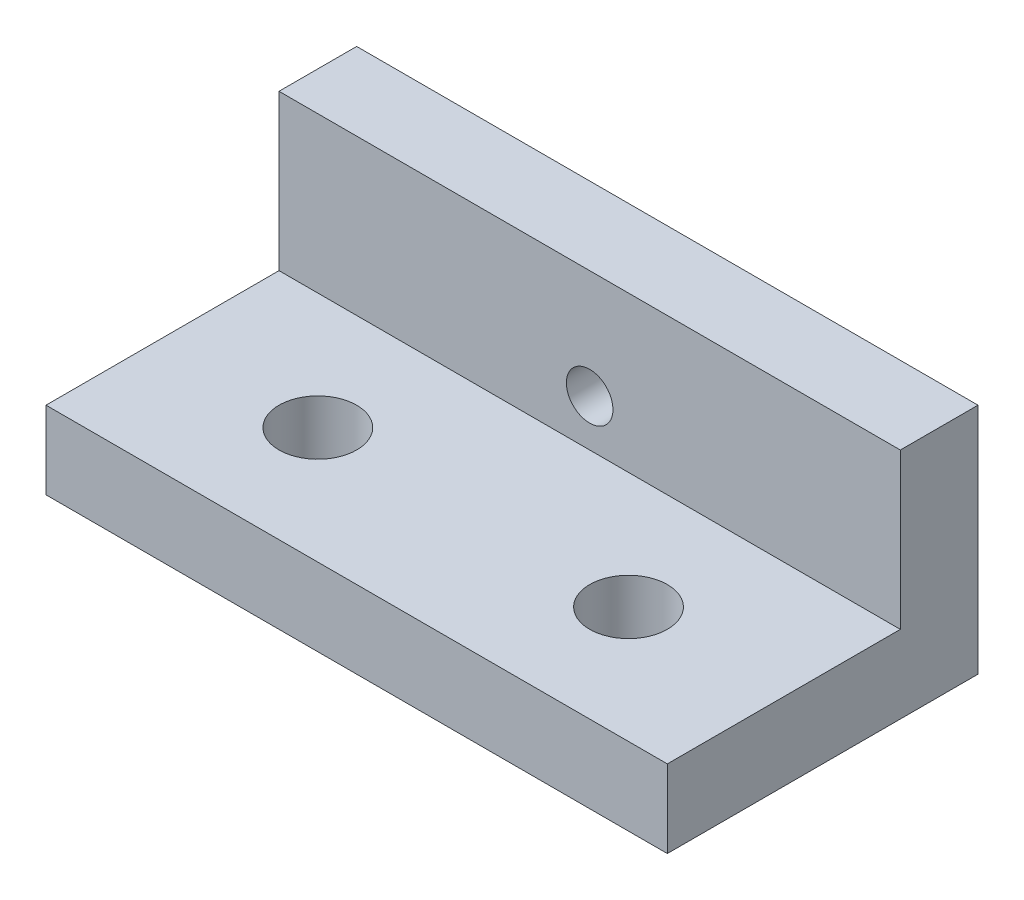
ISO-10303-21;
HEADER;
FILE_DESCRIPTION(('STEP AP214'),'2;1');
FILE_NAME('part.step','',(''),(''),'','','');
FILE_SCHEMA(('AUTOMOTIVE_DESIGN { 1 0 10303 214 1 1 1 1 }'));
ENDSEC;
DATA;
#1=APPLICATION_CONTEXT('core data for automotive mechanical design processes');
#2=APPLICATION_PROTOCOL_DEFINITION('international standard','automotive_design',2000,#1);
#3=PRODUCT_CONTEXT('',#1,'mechanical');
#4=PRODUCT('Part','Part','',(#3));
#5=PRODUCT_RELATED_PRODUCT_CATEGORY('part','',(#4));
#6=PRODUCT_DEFINITION_FORMATION('','',#4);
#7=PRODUCT_DEFINITION_CONTEXT('part definition',#1,'design');
#8=PRODUCT_DEFINITION('design','',#6,#7);
#9=PRODUCT_DEFINITION_SHAPE('','',#8);
#10=(LENGTH_UNIT() NAMED_UNIT(*) SI_UNIT(.MILLI.,.METRE.));
#11=(NAMED_UNIT(*) PLANE_ANGLE_UNIT() SI_UNIT($,.RADIAN.));
#12=(NAMED_UNIT(*) SI_UNIT($,.STERADIAN.) SOLID_ANGLE_UNIT());
#13=UNCERTAINTY_MEASURE_WITH_UNIT(LENGTH_MEASURE(1.E-05),#10,'distance_accuracy_value','');
#14=(GEOMETRIC_REPRESENTATION_CONTEXT(3) GLOBAL_UNCERTAINTY_ASSIGNED_CONTEXT((#13)) GLOBAL_UNIT_ASSIGNED_CONTEXT((#10,
#11,#12)) REPRESENTATION_CONTEXT('',''));
#15=CARTESIAN_POINT('',(0.,0.,0.));
#16=DIRECTION('',(0.,0.,1.));
#17=DIRECTION('',(1.,0.,0.));
#18=AXIS2_PLACEMENT_3D('',#15,#16,#17);
#19=CARTESIAN_POINT('',(0.,3.175,0.));
#20=DIRECTION('',(0.,-1.,0.));
#21=DIRECTION('',(0.,0.,-1.));
#22=AXIS2_PLACEMENT_3D('',#19,#20,#21);
#23=PLANE('',#22);
#24=CARTESIAN_POINT('',(19.05,3.175,-4.7625));
#25=DIRECTION('',(0.,1.,0.));
#26=DIRECTION('',(0.,0.,-1.));
#27=AXIS2_PLACEMENT_3D('',#24,#25,#26);
#28=CIRCLE('',#27,1.5875);
#29=CARTESIAN_POINT('',(19.05,3.175,-6.35));
#30=VERTEX_POINT('',#29);
#31=EDGE_CURVE('E159',#30,#30,#28,.T.);
#32=ORIENTED_EDGE('',*,*,#31,.F.);
#33=EDGE_LOOP('',(#32));
#34=FACE_BOUND('',#33,.T.);
#35=CARTESIAN_POINT('',(6.35,3.175,-4.7625));
#36=DIRECTION('',(0.,1.,0.));
#37=DIRECTION('',(0.,0.,1.));
#38=AXIS2_PLACEMENT_3D('',#35,#36,#37);
#39=CIRCLE('',#38,1.5875);
#40=CARTESIAN_POINT('',(6.35,3.175,-3.175));
#41=VERTEX_POINT('',#40);
#42=EDGE_CURVE('E153',#41,#41,#39,.T.);
#43=ORIENTED_EDGE('',*,*,#42,.F.);
#44=EDGE_LOOP('',(#43));
#45=FACE_BOUND('',#44,.T.);
#46=DIRECTION('',(1.,0.,0.));
#47=VECTOR('',#46,1.);
#48=CARTESIAN_POINT('',(0.,3.175,-9.525));
#49=LINE('',#48,#47);
#50=CARTESIAN_POINT('',(0.,3.175,-9.525));
#51=VERTEX_POINT('',#50);
#52=CARTESIAN_POINT('',(25.4,3.175,-9.525));
#53=VERTEX_POINT('',#52);
#54=EDGE_CURVE('E50',#51,#53,#49,.T.);
#55=ORIENTED_EDGE('',*,*,#54,.F.);
#56=DIRECTION('',(0.,0.,1.));
#57=VECTOR('',#56,1.);
#58=CARTESIAN_POINT('',(0.,3.175,0.));
#59=LINE('',#58,#57);
#60=CARTESIAN_POINT('',(0.,3.175,0.));
#61=VERTEX_POINT('',#60);
#62=EDGE_CURVE('E87',#51,#61,#59,.T.);
#63=ORIENTED_EDGE('',*,*,#62,.T.);
#64=DIRECTION('',(1.,0.,0.));
#65=VECTOR('',#64,1.);
#66=CARTESIAN_POINT('',(0.,3.175,0.));
#67=LINE('',#66,#65);
#68=CARTESIAN_POINT('',(25.4,3.175,0.));
#69=VERTEX_POINT('',#68);
#70=EDGE_CURVE('E56',#61,#69,#67,.T.);
#71=ORIENTED_EDGE('',*,*,#70,.T.);
#72=DIRECTION('',(0.,0.,-1.));
#73=VECTOR('',#72,1.);
#74=CARTESIAN_POINT('',(25.4,3.175,0.));
#75=LINE('',#74,#73);
#76=EDGE_CURVE('E98',#69,#53,#75,.T.);
#77=ORIENTED_EDGE('',*,*,#76,.T.);
#78=EDGE_LOOP('',(#55,#63,#71,#77));
#79=FACE_BOUND('',#78,.T.);
#80=ADVANCED_FACE('F33',(#34,#45,#79),#23,.F.);
#81=CARTESIAN_POINT('',(0.,3.175,0.));
#82=DIRECTION('',(1.,0.,0.));
#83=DIRECTION('',(0.,0.,-1.));
#84=AXIS2_PLACEMENT_3D('',#81,#82,#83);
#85=PLANE('',#84);
#86=DIRECTION('',(0.,0.,1.));
#87=VECTOR('',#86,1.);
#88=CARTESIAN_POINT('',(0.,0.,0.));
#89=LINE('',#88,#87);
#90=CARTESIAN_POINT('',(0.,0.,-12.7));
#91=VERTEX_POINT('',#90);
#92=CARTESIAN_POINT('',(0.,0.,0.));
#93=VERTEX_POINT('',#92);
#94=EDGE_CURVE('E94',#91,#93,#89,.T.);
#95=ORIENTED_EDGE('',*,*,#94,.T.);
#96=DIRECTION('',(0.,-1.,0.));
#97=VECTOR('',#96,1.);
#98=CARTESIAN_POINT('',(0.,3.175,0.));
#99=LINE('',#98,#97);
#100=EDGE_CURVE('E11',#61,#93,#99,.T.);
#101=ORIENTED_EDGE('',*,*,#100,.F.);
#102=ORIENTED_EDGE('',*,*,#62,.F.);
#103=DIRECTION('',(0.,-1.,0.));
#104=VECTOR('',#103,1.);
#105=CARTESIAN_POINT('',(0.,9.525,-9.525));
#106=LINE('',#105,#104);
#107=CARTESIAN_POINT('',(0.,9.525,-9.525));
#108=VERTEX_POINT('',#107);
#109=EDGE_CURVE('E102',#108,#51,#106,.T.);
#110=ORIENTED_EDGE('',*,*,#109,.F.);
#111=DIRECTION('',(0.,0.,1.));
#112=VECTOR('',#111,1.);
#113=CARTESIAN_POINT('',(0.,9.525,-12.7));
#114=LINE('',#113,#112);
#115=CARTESIAN_POINT('',(0.,9.525,-12.7));
#116=VERTEX_POINT('',#115);
#117=EDGE_CURVE('E97',#116,#108,#114,.T.);
#118=ORIENTED_EDGE('',*,*,#117,.F.);
#119=DIRECTION('',(0.,-1.,0.));
#120=VECTOR('',#119,1.);
#121=CARTESIAN_POINT('',(0.,3.175,-12.7));
#122=LINE('',#121,#120);
#123=EDGE_CURVE('E80',#116,#91,#122,.T.);
#124=ORIENTED_EDGE('',*,*,#123,.T.);
#125=EDGE_LOOP('',(#95,#101,#102,#110,#118,#124));
#126=FACE_BOUND('',#125,.T.);
#127=ADVANCED_FACE('F35',(#126),#85,.F.);
#128=CARTESIAN_POINT('',(0.,3.175,0.));
#129=DIRECTION('',(0.,0.,-1.));
#130=DIRECTION('',(-1.,0.,0.));
#131=AXIS2_PLACEMENT_3D('',#128,#129,#130);
#132=PLANE('',#131);
#133=DIRECTION('',(1.,0.,0.));
#134=VECTOR('',#133,1.);
#135=CARTESIAN_POINT('',(0.,0.,0.));
#136=LINE('',#135,#134);
#137=CARTESIAN_POINT('',(25.4,0.,0.));
#138=VERTEX_POINT('',#137);
#139=EDGE_CURVE('E101',#93,#138,#136,.T.);
#140=ORIENTED_EDGE('',*,*,#139,.T.);
#141=DIRECTION('',(0.,-1.,0.));
#142=VECTOR('',#141,1.);
#143=CARTESIAN_POINT('',(25.4,3.175,0.));
#144=LINE('',#143,#142);
#145=EDGE_CURVE('E42',#69,#138,#144,.T.);
#146=ORIENTED_EDGE('',*,*,#145,.F.);
#147=ORIENTED_EDGE('',*,*,#70,.F.);
#148=ORIENTED_EDGE('',*,*,#100,.T.);
#149=EDGE_LOOP('',(#140,#146,#147,#148));
#150=FACE_BOUND('',#149,.T.);
#151=ADVANCED_FACE('F202',(#150),#132,.F.);
#152=CARTESIAN_POINT('',(25.4,3.175,0.));
#153=DIRECTION('',(-1.,0.,0.));
#154=DIRECTION('',(0.,0.,1.));
#155=AXIS2_PLACEMENT_3D('',#152,#153,#154);
#156=PLANE('',#155);
#157=DIRECTION('',(0.,0.,-1.));
#158=VECTOR('',#157,1.);
#159=CARTESIAN_POINT('',(25.4,0.,0.));
#160=LINE('',#159,#158);
#161=CARTESIAN_POINT('',(25.4,0.,-12.7));
#162=VERTEX_POINT('',#161);
#163=EDGE_CURVE('E88',#138,#162,#160,.T.);
#164=ORIENTED_EDGE('',*,*,#163,.T.);
#165=DIRECTION('',(0.,-1.,0.));
#166=VECTOR('',#165,1.);
#167=CARTESIAN_POINT('',(25.4,3.175,-12.7));
#168=LINE('',#167,#166);
#169=CARTESIAN_POINT('',(25.4,9.525,-12.7));
#170=VERTEX_POINT('',#169);
#171=EDGE_CURVE('E83',#170,#162,#168,.T.);
#172=ORIENTED_EDGE('',*,*,#171,.F.);
#173=DIRECTION('',(0.,0.,-1.));
#174=VECTOR('',#173,1.);
#175=CARTESIAN_POINT('',(25.4,9.525,-12.7));
#176=LINE('',#175,#174);
#177=CARTESIAN_POINT('',(25.4,9.525,-9.525));
#178=VERTEX_POINT('',#177);
#179=EDGE_CURVE('E136',#178,#170,#176,.T.);
#180=ORIENTED_EDGE('',*,*,#179,.F.);
#181=DIRECTION('',(0.,-1.,0.));
#182=VECTOR('',#181,1.);
#183=CARTESIAN_POINT('',(25.4,9.525,-9.525));
#184=LINE('',#183,#182);
#185=EDGE_CURVE('E106',#178,#53,#184,.T.);
#186=ORIENTED_EDGE('',*,*,#185,.T.);
#187=ORIENTED_EDGE('',*,*,#76,.F.);
#188=ORIENTED_EDGE('',*,*,#145,.T.);
#189=EDGE_LOOP('',(#164,#172,#180,#186,#187,#188));
#190=FACE_BOUND('',#189,.T.);
#191=ADVANCED_FACE('F134',(#190),#156,.F.);
#192=CARTESIAN_POINT('',(0.,3.175,-12.7));
#193=DIRECTION('',(0.,0.,1.));
#194=DIRECTION('',(1.,0.,0.));
#195=AXIS2_PLACEMENT_3D('',#192,#193,#194);
#196=PLANE('',#195);
#197=CARTESIAN_POINT('',(12.7,5.08,-12.7));
#198=DIRECTION('',(0.,0.,-1.));
#199=DIRECTION('',(-1.,0.,0.));
#200=AXIS2_PLACEMENT_3D('',#197,#198,#199);
#201=CIRCLE('',#200,0.9525);
#202=CARTESIAN_POINT('',(11.7475,5.08,-12.7));
#203=VERTEX_POINT('',#202);
#204=EDGE_CURVE('E149',#203,#203,#201,.T.);
#205=ORIENTED_EDGE('',*,*,#204,.F.);
#206=EDGE_LOOP('',(#205));
#207=FACE_BOUND('',#206,.T.);
#208=DIRECTION('',(-1.,0.,0.));
#209=VECTOR('',#208,1.);
#210=CARTESIAN_POINT('',(0.,0.,-12.7));
#211=LINE('',#210,#209);
#212=EDGE_CURVE('E76',#162,#91,#211,.T.);
#213=ORIENTED_EDGE('',*,*,#212,.T.);
#214=ORIENTED_EDGE('',*,*,#123,.F.);
#215=DIRECTION('',(-1.,0.,0.));
#216=VECTOR('',#215,1.);
#217=CARTESIAN_POINT('',(0.,9.525,-12.7));
#218=LINE('',#217,#216);
#219=EDGE_CURVE('E137',#170,#116,#218,.T.);
#220=ORIENTED_EDGE('',*,*,#219,.F.);
#221=ORIENTED_EDGE('',*,*,#171,.T.);
#222=EDGE_LOOP('',(#213,#214,#220,#221));
#223=FACE_BOUND('',#222,.T.);
#224=ADVANCED_FACE('F78',(#207,#223),#196,.F.);
#225=CARTESIAN_POINT('',(0.,0.,0.));
#226=DIRECTION('',(0.,-1.,0.));
#227=DIRECTION('',(0.,0.,-1.));
#228=AXIS2_PLACEMENT_3D('',#225,#226,#227);
#229=PLANE('',#228);
#230=CARTESIAN_POINT('',(19.05,0.,-4.7625));
#231=DIRECTION('',(0.,1.,0.));
#232=DIRECTION('',(0.,0.,-1.));
#233=AXIS2_PLACEMENT_3D('',#230,#231,#232);
#234=CIRCLE('',#233,1.5875);
#235=CARTESIAN_POINT('',(19.05,0.,-6.35));
#236=VERTEX_POINT('',#235);
#237=EDGE_CURVE('E156',#236,#236,#234,.T.);
#238=ORIENTED_EDGE('',*,*,#237,.T.);
#239=EDGE_LOOP('',(#238));
#240=FACE_BOUND('',#239,.T.);
#241=CARTESIAN_POINT('',(6.35,0.,-4.7625));
#242=DIRECTION('',(0.,1.,0.));
#243=DIRECTION('',(0.,0.,1.));
#244=AXIS2_PLACEMENT_3D('',#241,#242,#243);
#245=CIRCLE('',#244,1.5875);
#246=CARTESIAN_POINT('',(6.35,0.,-3.175));
#247=VERTEX_POINT('',#246);
#248=EDGE_CURVE('E152',#247,#247,#245,.T.);
#249=ORIENTED_EDGE('',*,*,#248,.T.);
#250=EDGE_LOOP('',(#249));
#251=FACE_BOUND('',#250,.T.);
#252=ORIENTED_EDGE('',*,*,#94,.F.);
#253=ORIENTED_EDGE('',*,*,#212,.F.);
#254=ORIENTED_EDGE('',*,*,#163,.F.);
#255=ORIENTED_EDGE('',*,*,#139,.F.);
#256=EDGE_LOOP('',(#252,#253,#254,#255));
#257=FACE_BOUND('',#256,.T.);
#258=ADVANCED_FACE('F100',(#240,#251,#257),#229,.T.);
#259=CARTESIAN_POINT('',(0.,9.525,-9.525));
#260=DIRECTION('',(0.,0.,-1.));
#261=DIRECTION('',(-1.,0.,0.));
#262=AXIS2_PLACEMENT_3D('',#259,#260,#261);
#263=PLANE('',#262);
#264=CARTESIAN_POINT('',(12.7,5.08,-9.525));
#265=DIRECTION('',(0.,0.,-1.));
#266=DIRECTION('',(-1.,0.,0.));
#267=AXIS2_PLACEMENT_3D('',#264,#265,#266);
#268=CIRCLE('',#267,0.9525);
#269=CARTESIAN_POINT('',(11.7475,5.08,-9.525));
#270=VERTEX_POINT('',#269);
#271=EDGE_CURVE('E37',#270,#270,#268,.T.);
#272=ORIENTED_EDGE('',*,*,#271,.T.);
#273=EDGE_LOOP('',(#272));
#274=FACE_BOUND('',#273,.T.);
#275=ORIENTED_EDGE('',*,*,#54,.T.);
#276=ORIENTED_EDGE('',*,*,#185,.F.);
#277=DIRECTION('',(1.,0.,0.));
#278=VECTOR('',#277,1.);
#279=CARTESIAN_POINT('',(0.,9.525,-9.525));
#280=LINE('',#279,#278);
#281=EDGE_CURVE('E143',#108,#178,#280,.T.);
#282=ORIENTED_EDGE('',*,*,#281,.F.);
#283=ORIENTED_EDGE('',*,*,#109,.T.);
#284=EDGE_LOOP('',(#275,#276,#282,#283));
#285=FACE_BOUND('',#284,.T.);
#286=ADVANCED_FACE('F130',(#274,#285),#263,.F.);
#287=CARTESIAN_POINT('',(0.,9.525,0.));
#288=DIRECTION('',(0.,1.,0.));
#289=DIRECTION('',(0.,0.,1.));
#290=AXIS2_PLACEMENT_3D('',#287,#288,#289);
#291=PLANE('',#290);
#292=ORIENTED_EDGE('',*,*,#117,.T.);
#293=ORIENTED_EDGE('',*,*,#281,.T.);
#294=ORIENTED_EDGE('',*,*,#179,.T.);
#295=ORIENTED_EDGE('',*,*,#219,.T.);
#296=EDGE_LOOP('',(#292,#293,#294,#295));
#297=FACE_BOUND('',#296,.T.);
#298=ADVANCED_FACE('F186',(#297),#291,.T.);
#299=CARTESIAN_POINT('',(12.7,5.08,2.50000000007189E-05));
#300=DIRECTION('',(0.,0.,-1.));
#301=DIRECTION('',(-1.,0.,0.));
#302=AXIS2_PLACEMENT_3D('',#299,#300,#301);
#303=CYLINDRICAL_SURFACE('',#302,0.9525);
#304=ORIENTED_EDGE('',*,*,#204,.T.);
#305=EDGE_LOOP('',(#304));
#306=FACE_BOUND('',#305,.T.);
#307=ORIENTED_EDGE('',*,*,#271,.F.);
#308=EDGE_LOOP('',(#307));
#309=FACE_BOUND('',#308,.T.);
#310=ADVANCED_FACE('F180',(#306,#309),#303,.F.);
#311=CARTESIAN_POINT('',(6.35,0.,-4.7625));
#312=DIRECTION('',(0.,1.,0.));
#313=DIRECTION('',(0.,0.,1.));
#314=AXIS2_PLACEMENT_3D('',#311,#312,#313);
#315=CYLINDRICAL_SURFACE('',#314,1.5875);
#316=ORIENTED_EDGE('',*,*,#248,.F.);
#317=EDGE_LOOP('',(#316));
#318=FACE_BOUND('',#317,.T.);
#319=ORIENTED_EDGE('',*,*,#42,.T.);
#320=EDGE_LOOP('',(#319));
#321=FACE_BOUND('',#320,.T.);
#322=ADVANCED_FACE('F170',(#318,#321),#315,.F.);
#323=CARTESIAN_POINT('',(19.05,0.,-4.7625));
#324=DIRECTION('',(0.,1.,0.));
#325=DIRECTION('',(0.,0.,1.));
#326=AXIS2_PLACEMENT_3D('',#323,#324,#325);
#327=CYLINDRICAL_SURFACE('',#326,1.5875);
#328=ORIENTED_EDGE('',*,*,#237,.F.);
#329=EDGE_LOOP('',(#328));
#330=FACE_BOUND('',#329,.T.);
#331=ORIENTED_EDGE('',*,*,#31,.T.);
#332=EDGE_LOOP('',(#331));
#333=FACE_BOUND('',#332,.T.);
#334=ADVANCED_FACE('F167',(#330,#333),#327,.F.);
#335=CLOSED_SHELL('',(#80,#127,#151,#191,#224,#258,#286,#298,#310,#322,#334));
#336=MANIFOLD_SOLID_BREP('B2',#335);
#337=ADVANCED_BREP_SHAPE_REPRESENTATION('',(#18,#336),#14);
#338=SHAPE_DEFINITION_REPRESENTATION(#9,#337);
ENDSEC;
END-ISO-10303-21;
